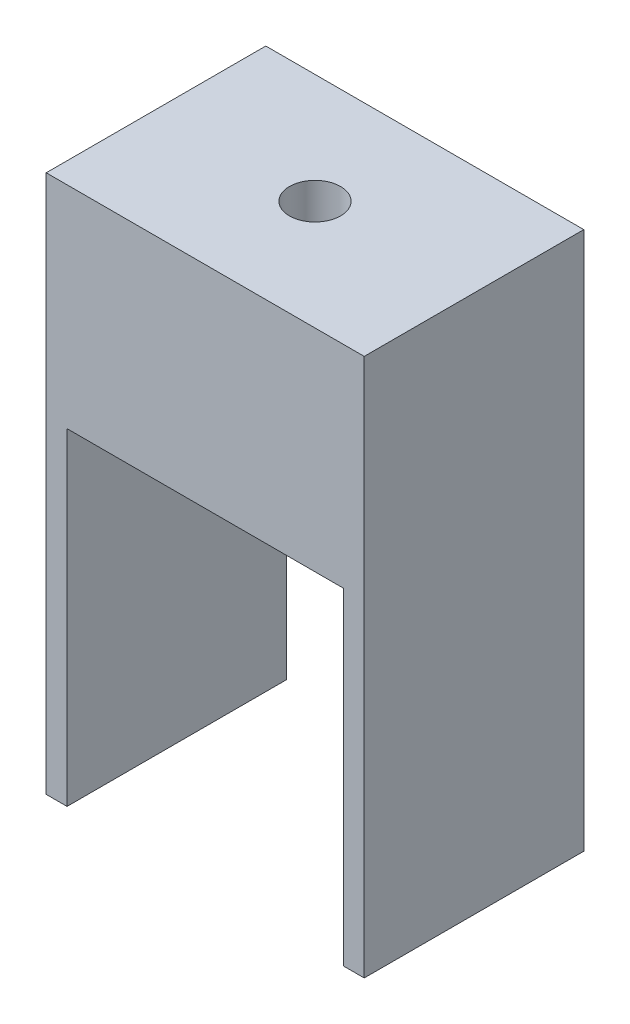
ISO-10303-21;
HEADER;
FILE_DESCRIPTION(('STEP AP214'),'2;1');
FILE_NAME('part.step','',(''),(''),'','','');
FILE_SCHEMA(('AUTOMOTIVE_DESIGN { 1 0 10303 214 1 1 1 1 }'));
ENDSEC;
DATA;
#1=APPLICATION_CONTEXT('core data for automotive mechanical design processes');
#2=APPLICATION_PROTOCOL_DEFINITION('international standard','automotive_design',2000,#1);
#3=PRODUCT_CONTEXT('',#1,'mechanical');
#4=PRODUCT('Part','Part','',(#3));
#5=PRODUCT_RELATED_PRODUCT_CATEGORY('part','',(#4));
#6=PRODUCT_DEFINITION_FORMATION('','',#4);
#7=PRODUCT_DEFINITION_CONTEXT('part definition',#1,'design');
#8=PRODUCT_DEFINITION('design','',#6,#7);
#9=PRODUCT_DEFINITION_SHAPE('','',#8);
#10=(LENGTH_UNIT() NAMED_UNIT(*) SI_UNIT(.MILLI.,.METRE.));
#11=(NAMED_UNIT(*) PLANE_ANGLE_UNIT() SI_UNIT($,.RADIAN.));
#12=(NAMED_UNIT(*) SI_UNIT($,.STERADIAN.) SOLID_ANGLE_UNIT());
#13=UNCERTAINTY_MEASURE_WITH_UNIT(LENGTH_MEASURE(1.E-05),#10,'distance_accuracy_value','');
#14=(GEOMETRIC_REPRESENTATION_CONTEXT(3) GLOBAL_UNCERTAINTY_ASSIGNED_CONTEXT((#13)) GLOBAL_UNIT_ASSIGNED_CONTEXT((#10,
#11,#12)) REPRESENTATION_CONTEXT('',''));
#15=CARTESIAN_POINT('',(0.,0.,0.));
#16=DIRECTION('',(0.,0.,1.));
#17=DIRECTION('',(1.,0.,0.));
#18=AXIS2_PLACEMENT_3D('',#15,#16,#17);
#19=CARTESIAN_POINT('',(0.,0.,0.));
#20=DIRECTION('',(0.,1.,0.));
#21=DIRECTION('',(0.,0.,1.));
#22=AXIS2_PLACEMENT_3D('',#19,#20,#21);
#23=PLANE('',#22);
#24=DIRECTION('',(0.,0.,-1.));
#25=VECTOR('',#24,1.);
#26=CARTESIAN_POINT('',(19.89,0.,15.805));
#27=LINE('',#26,#25);
#28=CARTESIAN_POINT('',(19.89,0.,15.805));
#29=VERTEX_POINT('',#28);
#30=CARTESIAN_POINT('',(19.89,0.,-15.805));
#31=VERTEX_POINT('',#30);
#32=EDGE_CURVE('E140',#29,#31,#27,.T.);
#33=ORIENTED_EDGE('',*,*,#32,.T.);
#34=DIRECTION('',(-1.,0.,0.));
#35=VECTOR('',#34,1.);
#36=CARTESIAN_POINT('',(-22.89,0.,-15.805));
#37=LINE('',#36,#35);
#38=CARTESIAN_POINT('',(22.89,0.,-15.805));
#39=VERTEX_POINT('',#38);
#40=EDGE_CURVE('E159',#39,#31,#37,.T.);
#41=ORIENTED_EDGE('',*,*,#40,.F.);
#42=DIRECTION('',(0.,0.,-1.));
#43=VECTOR('',#42,1.);
#44=CARTESIAN_POINT('',(22.89,0.,-15.805));
#45=LINE('',#44,#43);
#46=CARTESIAN_POINT('',(22.89,0.,15.805));
#47=VERTEX_POINT('',#46);
#48=EDGE_CURVE('E146',#47,#39,#45,.T.);
#49=ORIENTED_EDGE('',*,*,#48,.F.);
#50=DIRECTION('',(1.,0.,0.));
#51=VECTOR('',#50,1.);
#52=CARTESIAN_POINT('',(-22.89,0.,15.805));
#53=LINE('',#52,#51);
#54=EDGE_CURVE('E78',#29,#47,#53,.T.);
#55=ORIENTED_EDGE('',*,*,#54,.F.);
#56=EDGE_LOOP('',(#33,#41,#49,#55));
#57=FACE_BOUND('',#56,.T.);
#58=ADVANCED_FACE('F33',(#57),#23,.F.);
#59=CARTESIAN_POINT('',(22.89,77.5,-15.805));
#60=DIRECTION('',(-1.,0.,0.));
#61=DIRECTION('',(0.,0.,1.));
#62=AXIS2_PLACEMENT_3D('',#59,#60,#61);
#63=PLANE('',#62);
#64=ORIENTED_EDGE('',*,*,#48,.T.);
#65=DIRECTION('',(0.,-1.,0.));
#66=VECTOR('',#65,1.);
#67=CARTESIAN_POINT('',(22.89,77.5,-15.805));
#68=LINE('',#67,#66);
#69=CARTESIAN_POINT('',(22.89,77.5,-15.805));
#70=VERTEX_POINT('',#69);
#71=EDGE_CURVE('E11',#70,#39,#68,.T.);
#72=ORIENTED_EDGE('',*,*,#71,.F.);
#73=DIRECTION('',(0.,0.,-1.));
#74=VECTOR('',#73,1.);
#75=CARTESIAN_POINT('',(22.89,77.5,-15.805));
#76=LINE('',#75,#74);
#77=CARTESIAN_POINT('',(22.89,77.5,15.805));
#78=VERTEX_POINT('',#77);
#79=EDGE_CURVE('E149',#78,#70,#76,.T.);
#80=ORIENTED_EDGE('',*,*,#79,.F.);
#81=DIRECTION('',(0.,-1.,0.));
#82=VECTOR('',#81,1.);
#83=CARTESIAN_POINT('',(22.89,77.5,15.805));
#84=LINE('',#83,#82);
#85=EDGE_CURVE('E155',#78,#47,#84,.T.);
#86=ORIENTED_EDGE('',*,*,#85,.T.);
#87=EDGE_LOOP('',(#64,#72,#80,#86));
#88=FACE_BOUND('',#87,.T.);
#89=ADVANCED_FACE('F35',(#88),#63,.F.);
#90=CARTESIAN_POINT('',(-22.89,77.5,-15.805));
#91=DIRECTION('',(0.,0.,1.));
#92=DIRECTION('',(1.,0.,0.));
#93=AXIS2_PLACEMENT_3D('',#90,#91,#92);
#94=PLANE('',#93);
#95=DIRECTION('',(1.,0.,0.));
#96=VECTOR('',#95,1.);
#97=CARTESIAN_POINT('',(-19.89,47.1,-15.805));
#98=LINE('',#97,#96);
#99=CARTESIAN_POINT('',(-19.89,47.1,-15.805));
#100=VERTEX_POINT('',#99);
#101=CARTESIAN_POINT('',(19.89,47.1,-15.805));
#102=VERTEX_POINT('',#101);
#103=EDGE_CURVE('E131',#100,#102,#98,.T.);
#104=ORIENTED_EDGE('',*,*,#103,.F.);
#105=DIRECTION('',(0.,1.,0.));
#106=VECTOR('',#105,1.);
#107=CARTESIAN_POINT('',(-19.89,0.,-15.805));
#108=LINE('',#107,#106);
#109=CARTESIAN_POINT('',(-19.89,0.,-15.805));
#110=VERTEX_POINT('',#109);
#111=EDGE_CURVE('E113',#110,#100,#108,.T.);
#112=ORIENTED_EDGE('',*,*,#111,.F.);
#113=CARTESIAN_POINT('',(-22.89,0.,-15.805));
#114=VERTEX_POINT('',#113);
#115=EDGE_CURVE('E158',#110,#114,#37,.T.);
#116=ORIENTED_EDGE('',*,*,#115,.T.);
#117=DIRECTION('',(0.,-1.,0.));
#118=VECTOR('',#117,1.);
#119=CARTESIAN_POINT('',(-22.89,77.5,-15.805));
#120=LINE('',#119,#118);
#121=CARTESIAN_POINT('',(-22.89,77.5,-15.805));
#122=VERTEX_POINT('',#121);
#123=EDGE_CURVE('E41',#122,#114,#120,.T.);
#124=ORIENTED_EDGE('',*,*,#123,.F.);
#125=DIRECTION('',(-1.,0.,0.));
#126=VECTOR('',#125,1.);
#127=CARTESIAN_POINT('',(-22.89,77.5,-15.805));
#128=LINE('',#127,#126);
#129=EDGE_CURVE('E85',#70,#122,#128,.T.);
#130=ORIENTED_EDGE('',*,*,#129,.F.);
#131=ORIENTED_EDGE('',*,*,#71,.T.);
#132=ORIENTED_EDGE('',*,*,#40,.T.);
#133=DIRECTION('',(0.,1.,0.));
#134=VECTOR('',#133,1.);
#135=CARTESIAN_POINT('',(19.89,0.,-15.805));
#136=LINE('',#135,#134);
#137=EDGE_CURVE('E48',#31,#102,#136,.T.);
#138=ORIENTED_EDGE('',*,*,#137,.T.);
#139=EDGE_LOOP('',(#104,#112,#116,#124,#130,#131,#132,#138));
#140=FACE_BOUND('',#139,.T.);
#141=ADVANCED_FACE('F176',(#140),#94,.F.);
#142=CARTESIAN_POINT('',(-22.89,77.5,-15.805));
#143=DIRECTION('',(1.,0.,0.));
#144=DIRECTION('',(0.,0.,-1.));
#145=AXIS2_PLACEMENT_3D('',#142,#143,#144);
#146=PLANE('',#145);
#147=DIRECTION('',(0.,0.,1.));
#148=VECTOR('',#147,1.);
#149=CARTESIAN_POINT('',(-22.89,0.,-15.805));
#150=LINE('',#149,#148);
#151=CARTESIAN_POINT('',(-22.89,0.,15.805));
#152=VERTEX_POINT('',#151);
#153=EDGE_CURVE('E162',#114,#152,#150,.T.);
#154=ORIENTED_EDGE('',*,*,#153,.T.);
#155=DIRECTION('',(0.,-1.,0.));
#156=VECTOR('',#155,1.);
#157=CARTESIAN_POINT('',(-22.89,77.5,15.805));
#158=LINE('',#157,#156);
#159=CARTESIAN_POINT('',(-22.89,77.5,15.805));
#160=VERTEX_POINT('',#159);
#161=EDGE_CURVE('E166',#160,#152,#158,.T.);
#162=ORIENTED_EDGE('',*,*,#161,.F.);
#163=DIRECTION('',(0.,0.,1.));
#164=VECTOR('',#163,1.);
#165=CARTESIAN_POINT('',(-22.89,77.5,-15.805));
#166=LINE('',#165,#164);
#167=EDGE_CURVE('E152',#122,#160,#166,.T.);
#168=ORIENTED_EDGE('',*,*,#167,.F.);
#169=ORIENTED_EDGE('',*,*,#123,.T.);
#170=EDGE_LOOP('',(#154,#162,#168,#169));
#171=FACE_BOUND('',#170,.T.);
#172=ADVANCED_FACE('F171',(#171),#146,.F.);
#173=CARTESIAN_POINT('',(-22.89,77.5,15.805));
#174=DIRECTION('',(0.,0.,-1.));
#175=DIRECTION('',(-1.,0.,0.));
#176=AXIS2_PLACEMENT_3D('',#173,#174,#175);
#177=PLANE('',#176);
#178=CARTESIAN_POINT('',(-19.89,0.,15.805));
#179=VERTEX_POINT('',#178);
#180=EDGE_CURVE('E129',#152,#179,#53,.T.);
#181=ORIENTED_EDGE('',*,*,#180,.T.);
#182=DIRECTION('',(0.,1.,0.));
#183=VECTOR('',#182,1.);
#184=CARTESIAN_POINT('',(-19.89,0.,15.805));
#185=LINE('',#184,#183);
#186=CARTESIAN_POINT('',(-19.89,47.1,15.805));
#187=VERTEX_POINT('',#186);
#188=EDGE_CURVE('E110',#179,#187,#185,.T.);
#189=ORIENTED_EDGE('',*,*,#188,.T.);
#190=DIRECTION('',(1.,0.,0.));
#191=VECTOR('',#190,1.);
#192=CARTESIAN_POINT('',(-19.89,47.1,15.805));
#193=LINE('',#192,#191);
#194=CARTESIAN_POINT('',(19.89,47.1,15.805));
#195=VERTEX_POINT('',#194);
#196=EDGE_CURVE('E122',#187,#195,#193,.T.);
#197=ORIENTED_EDGE('',*,*,#196,.T.);
#198=DIRECTION('',(0.,1.,0.));
#199=VECTOR('',#198,1.);
#200=CARTESIAN_POINT('',(19.89,0.,15.805));
#201=LINE('',#200,#199);
#202=EDGE_CURVE('E118',#29,#195,#201,.T.);
#203=ORIENTED_EDGE('',*,*,#202,.F.);
#204=ORIENTED_EDGE('',*,*,#54,.T.);
#205=ORIENTED_EDGE('',*,*,#85,.F.);
#206=DIRECTION('',(1.,0.,0.));
#207=VECTOR('',#206,1.);
#208=CARTESIAN_POINT('',(-22.89,77.5,15.805));
#209=LINE('',#208,#207);
#210=EDGE_CURVE('E57',#160,#78,#209,.T.);
#211=ORIENTED_EDGE('',*,*,#210,.F.);
#212=ORIENTED_EDGE('',*,*,#161,.T.);
#213=EDGE_LOOP('',(#181,#189,#197,#203,#204,#205,#211,#212));
#214=FACE_BOUND('',#213,.T.);
#215=ADVANCED_FACE('F126',(#214),#177,.F.);
#216=CARTESIAN_POINT('',(0.,77.5,0.));
#217=DIRECTION('',(0.,1.,0.));
#218=DIRECTION('',(0.,0.,1.));
#219=AXIS2_PLACEMENT_3D('',#216,#217,#218);
#220=PLANE('',#219);
#221=CARTESIAN_POINT('',(0.,77.5,0.));
#222=DIRECTION('',(0.,1.,0.));
#223=DIRECTION('',(0.,0.,1.));
#224=AXIS2_PLACEMENT_3D('',#221,#222,#223);
#225=CIRCLE('',#224,3.675);
#226=CARTESIAN_POINT('',(0.,77.5,3.675));
#227=VERTEX_POINT('',#226);
#228=EDGE_CURVE('E139',#227,#227,#225,.T.);
#229=ORIENTED_EDGE('',*,*,#228,.F.);
#230=EDGE_LOOP('',(#229));
#231=FACE_BOUND('',#230,.T.);
#232=ORIENTED_EDGE('',*,*,#79,.T.);
#233=ORIENTED_EDGE('',*,*,#129,.T.);
#234=ORIENTED_EDGE('',*,*,#167,.T.);
#235=ORIENTED_EDGE('',*,*,#210,.T.);
#236=EDGE_LOOP('',(#232,#233,#234,#235));
#237=FACE_BOUND('',#236,.T.);
#238=ADVANCED_FACE('F200',(#231,#237),#220,.T.);
#239=ORIENTED_EDGE('',*,*,#115,.F.);
#240=DIRECTION('',(0.,0.,-1.));
#241=VECTOR('',#240,1.);
#242=CARTESIAN_POINT('',(-19.89,0.,15.805));
#243=LINE('',#242,#241);
#244=EDGE_CURVE('E137',#179,#110,#243,.T.);
#245=ORIENTED_EDGE('',*,*,#244,.F.);
#246=ORIENTED_EDGE('',*,*,#180,.F.);
#247=ORIENTED_EDGE('',*,*,#153,.F.);
#248=EDGE_LOOP('',(#239,#245,#246,#247));
#249=FACE_BOUND('',#248,.T.);
#250=ADVANCED_FACE('F175',(#249),#23,.F.);
#251=CARTESIAN_POINT('',(0.,52.1,0.));
#252=DIRECTION('',(0.,1.,0.));
#253=DIRECTION('',(0.,0.,1.));
#254=AXIS2_PLACEMENT_3D('',#251,#252,#253);
#255=CYLINDRICAL_SURFACE('',#254,3.675);
#256=CARTESIAN_POINT('',(0.,52.1,0.));
#257=DIRECTION('',(0.,1.,0.));
#258=DIRECTION('',(0.,0.,1.));
#259=AXIS2_PLACEMENT_3D('',#256,#257,#258);
#260=CIRCLE('',#259,3.675);
#261=CARTESIAN_POINT('',(0.,52.1,3.675));
#262=VERTEX_POINT('',#261);
#263=EDGE_CURVE('E143',#262,#262,#260,.T.);
#264=ORIENTED_EDGE('',*,*,#263,.F.);
#265=EDGE_LOOP('',(#264));
#266=FACE_BOUND('',#265,.T.);
#267=ORIENTED_EDGE('',*,*,#228,.T.);
#268=EDGE_LOOP('',(#267));
#269=FACE_BOUND('',#268,.T.);
#270=ADVANCED_FACE('F199',(#266,#269),#255,.F.);
#271=CARTESIAN_POINT('',(0.,52.1,0.));
#272=DIRECTION('',(0.,1.,0.));
#273=DIRECTION('',(0.,0.,1.));
#274=AXIS2_PLACEMENT_3D('',#271,#272,#273);
#275=PLANE('',#274);
#276=ORIENTED_EDGE('',*,*,#263,.T.);
#277=EDGE_LOOP('',(#276));
#278=FACE_BOUND('',#277,.T.);
#279=ADVANCED_FACE('F188',(#278),#275,.T.);
#280=CARTESIAN_POINT('',(-19.89,0.,15.805));
#281=DIRECTION('',(-1.,0.,0.));
#282=DIRECTION('',(0.,-1.,0.));
#283=AXIS2_PLACEMENT_3D('',#280,#281,#282);
#284=PLANE('',#283);
#285=ORIENTED_EDGE('',*,*,#111,.T.);
#286=DIRECTION('',(0.,0.,-1.));
#287=VECTOR('',#286,1.);
#288=CARTESIAN_POINT('',(-19.89,47.1,15.805));
#289=LINE('',#288,#287);
#290=EDGE_CURVE('E106',#187,#100,#289,.T.);
#291=ORIENTED_EDGE('',*,*,#290,.F.);
#292=ORIENTED_EDGE('',*,*,#188,.F.);
#293=ORIENTED_EDGE('',*,*,#244,.T.);
#294=EDGE_LOOP('',(#285,#291,#292,#293));
#295=FACE_BOUND('',#294,.T.);
#296=ADVANCED_FACE('F108',(#295),#284,.F.);
#297=CARTESIAN_POINT('',(19.89,0.,15.805));
#298=DIRECTION('',(-1.,0.,0.));
#299=DIRECTION('',(0.,-1.,0.));
#300=AXIS2_PLACEMENT_3D('',#297,#298,#299);
#301=PLANE('',#300);
#302=ORIENTED_EDGE('',*,*,#137,.F.);
#303=ORIENTED_EDGE('',*,*,#32,.F.);
#304=ORIENTED_EDGE('',*,*,#202,.T.);
#305=DIRECTION('',(0.,0.,-1.));
#306=VECTOR('',#305,1.);
#307=CARTESIAN_POINT('',(19.89,47.1,15.805));
#308=LINE('',#307,#306);
#309=EDGE_CURVE('E117',#195,#102,#308,.T.);
#310=ORIENTED_EDGE('',*,*,#309,.T.);
#311=EDGE_LOOP('',(#302,#303,#304,#310));
#312=FACE_BOUND('',#311,.T.);
#313=ADVANCED_FACE('F180',(#312),#301,.T.);
#314=CARTESIAN_POINT('',(-19.89,47.1,15.805));
#315=DIRECTION('',(0.,1.,0.));
#316=DIRECTION('',(-1.,0.,0.));
#317=AXIS2_PLACEMENT_3D('',#314,#315,#316);
#318=PLANE('',#317);
#319=ORIENTED_EDGE('',*,*,#103,.T.);
#320=ORIENTED_EDGE('',*,*,#309,.F.);
#321=ORIENTED_EDGE('',*,*,#196,.F.);
#322=ORIENTED_EDGE('',*,*,#290,.T.);
#323=EDGE_LOOP('',(#319,#320,#321,#322));
#324=FACE_BOUND('',#323,.T.);
#325=ADVANCED_FACE('F123',(#324),#318,.F.);
#326=CLOSED_SHELL('',(#58,#89,#141,#172,#215,#238,#250,#270,#279,#296,#313,#325));
#327=MANIFOLD_SOLID_BREP('B2',#326);
#328=ADVANCED_BREP_SHAPE_REPRESENTATION('',(#18,#327),#14);
#329=SHAPE_DEFINITION_REPRESENTATION(#9,#328);
ENDSEC;
END-ISO-10303-21;
